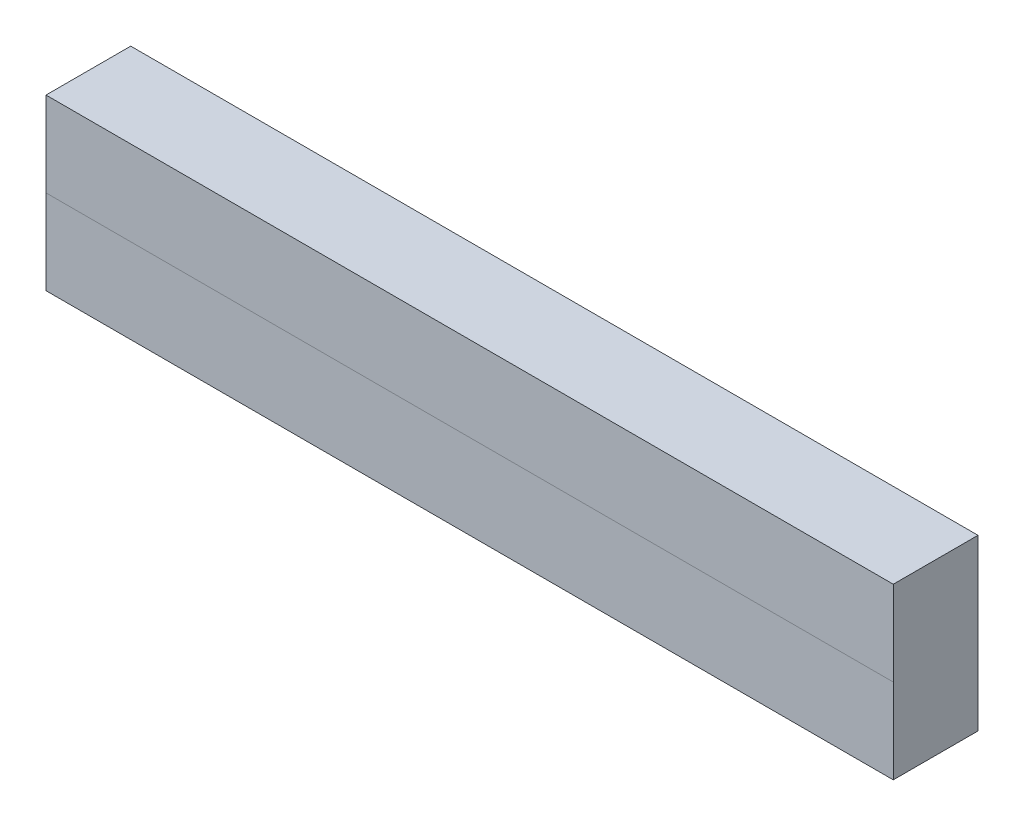
ISO-10303-21;
HEADER;
FILE_DESCRIPTION(('STEP AP214'),'2;1');
FILE_NAME('part.step','',(''),(''),'','','');
FILE_SCHEMA(('AUTOMOTIVE_DESIGN { 1 0 10303 214 1 1 1 1 }'));
ENDSEC;
DATA;
#1=APPLICATION_CONTEXT('core data for automotive mechanical design processes');
#2=APPLICATION_PROTOCOL_DEFINITION('international standard','automotive_design',2000,#1);
#3=PRODUCT_CONTEXT('',#1,'mechanical');
#4=PRODUCT('Part','Part','',(#3));
#5=PRODUCT_RELATED_PRODUCT_CATEGORY('part','',(#4));
#6=PRODUCT_DEFINITION_FORMATION('','',#4);
#7=PRODUCT_DEFINITION_CONTEXT('part definition',#1,'design');
#8=PRODUCT_DEFINITION('design','',#6,#7);
#9=PRODUCT_DEFINITION_SHAPE('','',#8);
#10=(LENGTH_UNIT() NAMED_UNIT(*) SI_UNIT(.MILLI.,.METRE.));
#11=(NAMED_UNIT(*) PLANE_ANGLE_UNIT() SI_UNIT($,.RADIAN.));
#12=(NAMED_UNIT(*) SI_UNIT($,.STERADIAN.) SOLID_ANGLE_UNIT());
#13=UNCERTAINTY_MEASURE_WITH_UNIT(LENGTH_MEASURE(1.E-05),#10,'distance_accuracy_value','');
#14=(GEOMETRIC_REPRESENTATION_CONTEXT(3) GLOBAL_UNCERTAINTY_ASSIGNED_CONTEXT((#13)) GLOBAL_UNIT_ASSIGNED_CONTEXT((#10,
#11,#12)) REPRESENTATION_CONTEXT('',''));
#15=CARTESIAN_POINT('',(0.,0.,0.));
#16=DIRECTION('',(0.,0.,1.));
#17=DIRECTION('',(1.,0.,0.));
#18=AXIS2_PLACEMENT_3D('',#15,#16,#17);
#19=CARTESIAN_POINT('',(100.,-10.,5.));
#20=DIRECTION('',(0.,0.,-1.));
#21=DIRECTION('',(-1.,0.,0.));
#22=AXIS2_PLACEMENT_3D('',#19,#20,#21);
#23=PLANE('',#22);
#24=DIRECTION('',(1.,0.,0.));
#25=VECTOR('',#24,1.);
#26=CARTESIAN_POINT('',(100.,0.,5.));
#27=LINE('',#26,#25);
#28=CARTESIAN_POINT('',(0.,0.,5.));
#29=VERTEX_POINT('',#28);
#30=CARTESIAN_POINT('',(100.,0.,5.));
#31=VERTEX_POINT('',#30);
#32=EDGE_CURVE('E12',#29,#31,#27,.T.);
#33=ORIENTED_EDGE('',*,*,#32,.F.);
#34=DIRECTION('',(0.,-1.,0.));
#35=VECTOR('',#34,1.);
#36=CARTESIAN_POINT('',(0.,-10.,5.));
#37=LINE('',#36,#35);
#38=CARTESIAN_POINT('',(0.,-10.,5.));
#39=VERTEX_POINT('',#38);
#40=EDGE_CURVE('E106',#29,#39,#37,.T.);
#41=ORIENTED_EDGE('',*,*,#40,.T.);
#42=DIRECTION('',(-1.,0.,0.));
#43=VECTOR('',#42,1.);
#44=CARTESIAN_POINT('',(100.,-10.,5.));
#45=LINE('',#44,#43);
#46=CARTESIAN_POINT('',(100.,-10.,5.));
#47=VERTEX_POINT('',#46);
#48=EDGE_CURVE('E54',#47,#39,#45,.T.);
#49=ORIENTED_EDGE('',*,*,#48,.F.);
#50=DIRECTION('',(0.,-1.,0.));
#51=VECTOR('',#50,1.);
#52=CARTESIAN_POINT('',(100.,-10.,5.));
#53=LINE('',#52,#51);
#54=EDGE_CURVE('E89',#31,#47,#53,.T.);
#55=ORIENTED_EDGE('',*,*,#54,.F.);
#56=EDGE_LOOP('',(#33,#41,#49,#55));
#57=FACE_BOUND('',#56,.T.);
#58=ADVANCED_FACE('F44',(#57),#23,.F.);
#59=CARTESIAN_POINT('',(0.,10.,5.));
#60=VERTEX_POINT('',#59);
#61=EDGE_CURVE('E132',#60,#29,#37,.T.);
#62=ORIENTED_EDGE('',*,*,#61,.T.);
#63=ORIENTED_EDGE('',*,*,#32,.T.);
#64=CARTESIAN_POINT('',(100.,10.,5.));
#65=VERTEX_POINT('',#64);
#66=EDGE_CURVE('E94',#65,#31,#53,.T.);
#67=ORIENTED_EDGE('',*,*,#66,.F.);
#68=DIRECTION('',(-1.,0.,0.));
#69=VECTOR('',#68,1.);
#70=CARTESIAN_POINT('',(100.,10.,5.));
#71=LINE('',#70,#69);
#72=EDGE_CURVE('E113',#65,#60,#71,.T.);
#73=ORIENTED_EDGE('',*,*,#72,.T.);
#74=EDGE_LOOP('',(#62,#63,#67,#73));
#75=FACE_BOUND('',#74,.T.);
#76=ADVANCED_FACE('F46',(#75),#23,.F.);
#77=CARTESIAN_POINT('',(100.,-10.,-5.));
#78=DIRECTION('',(0.,1.,0.));
#79=DIRECTION('',(0.,0.,1.));
#80=AXIS2_PLACEMENT_3D('',#77,#78,#79);
#81=PLANE('',#80);
#82=DIRECTION('',(0.,0.,-1.));
#83=VECTOR('',#82,1.);
#84=CARTESIAN_POINT('',(0.,-10.,-5.));
#85=LINE('',#84,#83);
#86=CARTESIAN_POINT('',(0.,-10.,-5.));
#87=VERTEX_POINT('',#86);
#88=EDGE_CURVE('E121',#39,#87,#85,.T.);
#89=ORIENTED_EDGE('',*,*,#88,.T.);
#90=DIRECTION('',(-1.,0.,0.));
#91=VECTOR('',#90,1.);
#92=CARTESIAN_POINT('',(100.,-10.,-5.));
#93=LINE('',#92,#91);
#94=CARTESIAN_POINT('',(100.,-10.,-5.));
#95=VERTEX_POINT('',#94);
#96=EDGE_CURVE('E102',#95,#87,#93,.T.);
#97=ORIENTED_EDGE('',*,*,#96,.F.);
#98=DIRECTION('',(0.,0.,-1.));
#99=VECTOR('',#98,1.);
#100=CARTESIAN_POINT('',(100.,-10.,-5.));
#101=LINE('',#100,#99);
#102=EDGE_CURVE('E92',#47,#95,#101,.T.);
#103=ORIENTED_EDGE('',*,*,#102,.F.);
#104=ORIENTED_EDGE('',*,*,#48,.T.);
#105=EDGE_LOOP('',(#89,#97,#103,#104));
#106=FACE_BOUND('',#105,.T.);
#107=ADVANCED_FACE('F100',(#106),#81,.F.);
#108=CARTESIAN_POINT('',(100.,-10.,-5.));
#109=DIRECTION('',(0.,0.,1.));
#110=DIRECTION('',(1.,0.,0.));
#111=AXIS2_PLACEMENT_3D('',#108,#109,#110);
#112=PLANE('',#111);
#113=DIRECTION('',(0.,1.,0.));
#114=VECTOR('',#113,1.);
#115=CARTESIAN_POINT('',(0.,-10.,-5.));
#116=LINE('',#115,#114);
#117=CARTESIAN_POINT('',(0.,10.,-5.));
#118=VERTEX_POINT('',#117);
#119=EDGE_CURVE('E118',#87,#118,#116,.T.);
#120=ORIENTED_EDGE('',*,*,#119,.T.);
#121=DIRECTION('',(-1.,0.,0.));
#122=VECTOR('',#121,1.);
#123=CARTESIAN_POINT('',(100.,10.,-5.));
#124=LINE('',#123,#122);
#125=CARTESIAN_POINT('',(100.,10.,-5.));
#126=VERTEX_POINT('',#125);
#127=EDGE_CURVE('E108',#126,#118,#124,.T.);
#128=ORIENTED_EDGE('',*,*,#127,.F.);
#129=DIRECTION('',(0.,1.,0.));
#130=VECTOR('',#129,1.);
#131=CARTESIAN_POINT('',(100.,-10.,-5.));
#132=LINE('',#131,#130);
#133=EDGE_CURVE('E104',#95,#126,#132,.T.);
#134=ORIENTED_EDGE('',*,*,#133,.F.);
#135=ORIENTED_EDGE('',*,*,#96,.T.);
#136=EDGE_LOOP('',(#120,#128,#134,#135));
#137=FACE_BOUND('',#136,.T.);
#138=ADVANCED_FACE('F138',(#137),#112,.F.);
#139=CARTESIAN_POINT('',(100.,10.,-5.));
#140=DIRECTION('',(0.,-1.,0.));
#141=DIRECTION('',(0.,0.,-1.));
#142=AXIS2_PLACEMENT_3D('',#139,#140,#141);
#143=PLANE('',#142);
#144=DIRECTION('',(0.,0.,1.));
#145=VECTOR('',#144,1.);
#146=CARTESIAN_POINT('',(0.,10.,-5.));
#147=LINE('',#146,#145);
#148=EDGE_CURVE('E96',#118,#60,#147,.T.);
#149=ORIENTED_EDGE('',*,*,#148,.T.);
#150=ORIENTED_EDGE('',*,*,#72,.F.);
#151=DIRECTION('',(0.,0.,1.));
#152=VECTOR('',#151,1.);
#153=CARTESIAN_POINT('',(100.,10.,-5.));
#154=LINE('',#153,#152);
#155=EDGE_CURVE('E116',#126,#65,#154,.T.);
#156=ORIENTED_EDGE('',*,*,#155,.F.);
#157=ORIENTED_EDGE('',*,*,#127,.T.);
#158=EDGE_LOOP('',(#149,#150,#156,#157));
#159=FACE_BOUND('',#158,.T.);
#160=ADVANCED_FACE('F144',(#159),#143,.F.);
#161=CARTESIAN_POINT('',(100.,0.,0.));
#162=DIRECTION('',(1.,0.,0.));
#163=DIRECTION('',(0.,0.,-1.));
#164=AXIS2_PLACEMENT_3D('',#161,#162,#163);
#165=PLANE('',#164);
#166=ORIENTED_EDGE('',*,*,#66,.T.);
#167=ORIENTED_EDGE('',*,*,#54,.T.);
#168=ORIENTED_EDGE('',*,*,#102,.T.);
#169=ORIENTED_EDGE('',*,*,#133,.T.);
#170=ORIENTED_EDGE('',*,*,#155,.T.);
#171=EDGE_LOOP('',(#166,#167,#168,#169,#170));
#172=FACE_BOUND('',#171,.T.);
#173=ADVANCED_FACE('F91',(#172),#165,.T.);
#174=CARTESIAN_POINT('',(0.,0.,0.));
#175=DIRECTION('',(1.,0.,0.));
#176=DIRECTION('',(0.,0.,-1.));
#177=AXIS2_PLACEMENT_3D('',#174,#175,#176);
#178=PLANE('',#177);
#179=ORIENTED_EDGE('',*,*,#61,.F.);
#180=ORIENTED_EDGE('',*,*,#148,.F.);
#181=ORIENTED_EDGE('',*,*,#119,.F.);
#182=ORIENTED_EDGE('',*,*,#88,.F.);
#183=ORIENTED_EDGE('',*,*,#40,.F.);
#184=EDGE_LOOP('',(#179,#180,#181,#182,#183));
#185=FACE_BOUND('',#184,.T.);
#186=ADVANCED_FACE('F141',(#185),#178,.F.);
#187=CLOSED_SHELL('',(#58,#76,#107,#138,#160,#173,#186));
#188=MANIFOLD_SOLID_BREP('B2',#187);
#189=ADVANCED_BREP_SHAPE_REPRESENTATION('',(#18,#188),#14);
#190=SHAPE_DEFINITION_REPRESENTATION(#9,#189);
ENDSEC;
END-ISO-10303-21;
